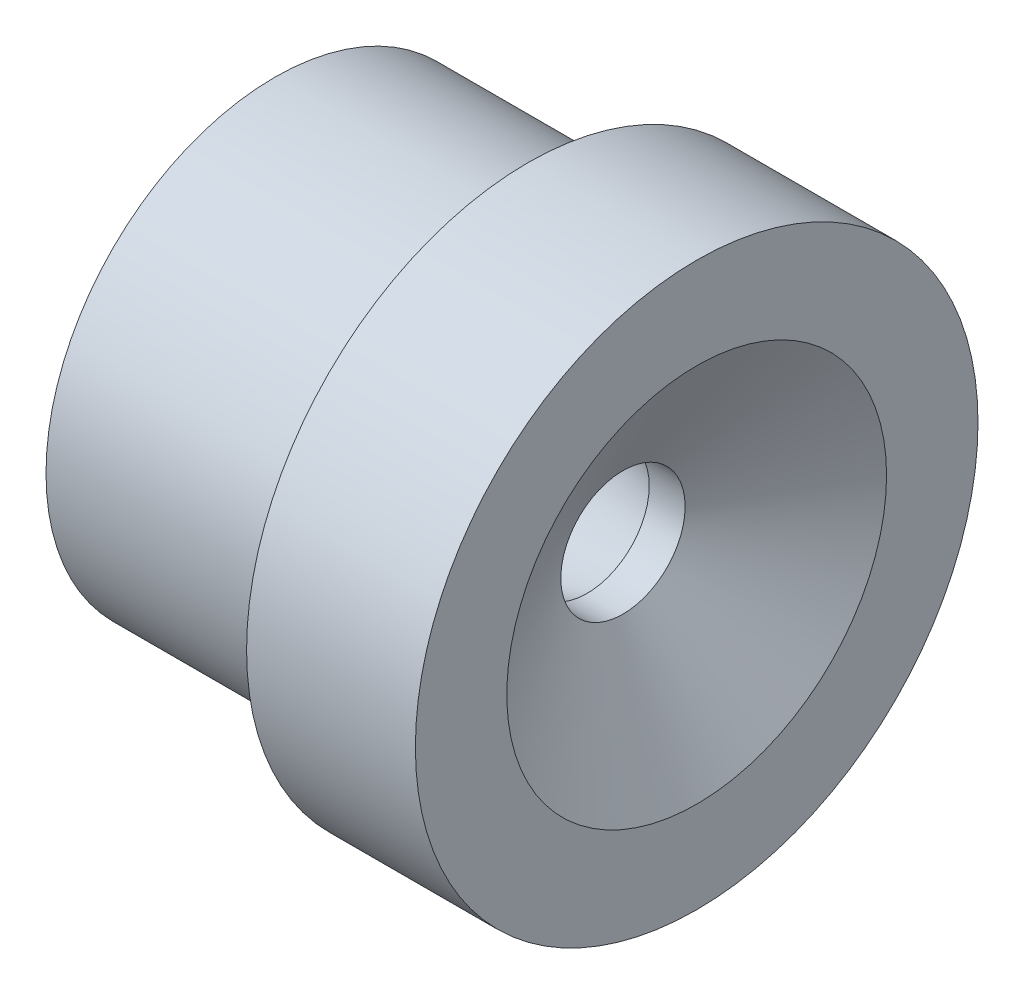
ISO-10303-21;
HEADER;
FILE_DESCRIPTION(('STEP AP214'),'2;1');
FILE_NAME('part.step','',(''),(''),'','','');
FILE_SCHEMA(('AUTOMOTIVE_DESIGN { 1 0 10303 214 1 1 1 1 }'));
ENDSEC;
DATA;
#1=APPLICATION_CONTEXT('core data for automotive mechanical design processes');
#2=APPLICATION_PROTOCOL_DEFINITION('international standard','automotive_design',2000,#1);
#3=PRODUCT_CONTEXT('',#1,'mechanical');
#4=PRODUCT('Part','Part','',(#3));
#5=PRODUCT_RELATED_PRODUCT_CATEGORY('part','',(#4));
#6=PRODUCT_DEFINITION_FORMATION('','',#4);
#7=PRODUCT_DEFINITION_CONTEXT('part definition',#1,'design');
#8=PRODUCT_DEFINITION('design','',#6,#7);
#9=PRODUCT_DEFINITION_SHAPE('','',#8);
#10=(LENGTH_UNIT() NAMED_UNIT(*) SI_UNIT(.MILLI.,.METRE.));
#11=(NAMED_UNIT(*) PLANE_ANGLE_UNIT() SI_UNIT($,.RADIAN.));
#12=(NAMED_UNIT(*) SI_UNIT($,.STERADIAN.) SOLID_ANGLE_UNIT());
#13=UNCERTAINTY_MEASURE_WITH_UNIT(LENGTH_MEASURE(1.E-05),#10,'distance_accuracy_value','');
#14=(GEOMETRIC_REPRESENTATION_CONTEXT(3) GLOBAL_UNCERTAINTY_ASSIGNED_CONTEXT((#13)) GLOBAL_UNIT_ASSIGNED_CONTEXT((#10,
#11,#12)) REPRESENTATION_CONTEXT('',''));
#15=CARTESIAN_POINT('',(0.,0.,0.));
#16=DIRECTION('',(0.,0.,1.));
#17=DIRECTION('',(1.,0.,0.));
#18=AXIS2_PLACEMENT_3D('',#15,#16,#17);
#19=CARTESIAN_POINT('',(5.11872970120267,0.,-12.7));
#20=DIRECTION('',(1.,0.,0.));
#21=DIRECTION('',(0.,0.,-1.));
#22=AXIS2_PLACEMENT_3D('',#19,#20,#21);
#23=CYLINDRICAL_SURFACE('',#22,12.7);
#24=CARTESIAN_POINT('',(0.,0.,-12.7));
#25=DIRECTION('',(1.,0.,0.));
#26=DIRECTION('',(0.,0.,-1.));
#27=AXIS2_PLACEMENT_3D('',#24,#25,#26);
#28=CIRCLE('',#27,12.7);
#29=CARTESIAN_POINT('',(0.,0.,-25.4));
#30=VERTEX_POINT('',#29);
#31=EDGE_CURVE('E13',#30,#30,#28,.T.);
#32=ORIENTED_EDGE('',*,*,#31,.F.);
#33=EDGE_LOOP('',(#32));
#34=FACE_BOUND('',#33,.T.);
#35=CARTESIAN_POINT('',(-7.62,0.,-12.7));
#36=DIRECTION('',(1.,0.,0.));
#37=DIRECTION('',(0.,0.,-1.));
#38=AXIS2_PLACEMENT_3D('',#35,#36,#37);
#39=CIRCLE('',#38,12.7);
#40=CARTESIAN_POINT('',(-7.62000000000001,0.,-25.4));
#41=VERTEX_POINT('',#40);
#42=EDGE_CURVE('E96',#41,#41,#39,.T.);
#43=ORIENTED_EDGE('',*,*,#42,.T.);
#44=EDGE_LOOP('',(#43));
#45=FACE_BOUND('',#44,.T.);
#46=ADVANCED_FACE('F56',(#34,#45),#23,.T.);
#47=CARTESIAN_POINT('',(0.,0.,0.));
#48=DIRECTION('',(-1.,0.,0.));
#49=DIRECTION('',(0.,0.,1.));
#50=AXIS2_PLACEMENT_3D('',#47,#48,#49);
#51=PLANE('',#50);
#52=CARTESIAN_POINT('',(0.,0.,-12.7));
#53=DIRECTION('',(1.,0.,0.));
#54=DIRECTION('',(0.,0.,-1.));
#55=AXIS2_PLACEMENT_3D('',#52,#53,#54);
#56=CIRCLE('',#55,8.5725);
#57=CARTESIAN_POINT('',(0.,0.,-21.2725));
#58=VERTEX_POINT('',#57);
#59=EDGE_CURVE('E68',#58,#58,#56,.T.);
#60=ORIENTED_EDGE('',*,*,#59,.F.);
#61=EDGE_LOOP('',(#60));
#62=FACE_BOUND('',#61,.T.);
#63=ORIENTED_EDGE('',*,*,#31,.T.);
#64=EDGE_LOOP('',(#63));
#65=FACE_BOUND('',#64,.T.);
#66=ADVANCED_FACE('F132',(#62,#65),#51,.F.);
#67=CARTESIAN_POINT('',(0.,0.,-12.7));
#68=DIRECTION('',(1.,0.,0.));
#69=DIRECTION('',(0.,0.,-1.));
#70=AXIS2_PLACEMENT_3D('',#67,#68,#69);
#71=CONICAL_SURFACE('',#70,8.5725,1.0471975511966);
#72=CARTESIAN_POINT('',(-3.32888618209353,0.,-12.7));
#73=DIRECTION('',(1.,0.,0.));
#74=DIRECTION('',(0.,0.,-1.));
#75=AXIS2_PLACEMENT_3D('',#72,#73,#74);
#76=CIRCLE('',#75,2.8067);
#77=CARTESIAN_POINT('',(-3.32888618209353,0.,-15.5067));
#78=VERTEX_POINT('',#77);
#79=EDGE_CURVE('E75',#78,#78,#76,.T.);
#80=CARTESIAN_POINT('',(-3.32888618209353,0.,-15.5067));
#81=CARTESIAN_POINT('',(-3.29421028436339,0.,-15.5667604166667));
#82=CARTESIAN_POINT('',(-3.25953438663325,0.,-15.6268208333333));
#83=CARTESIAN_POINT('',(-3.19018259117297,0.,-15.7469416666667));
#84=CARTESIAN_POINT('',(-3.15550669344282,0.,-15.8070020833333));
#85=CARTESIAN_POINT('',(-3.08615489798254,0.,-15.9271229166667));
#86=CARTESIAN_POINT('',(-3.0514790002524,0.,-15.9871833333333));
#87=CARTESIAN_POINT('',(-2.98212720479212,0.,-16.1073041666667));
#88=CARTESIAN_POINT('',(-2.94745130706198,0.,-16.1673645833333));
#89=CARTESIAN_POINT('',(-2.8780995116017,0.,-16.2874854166667));
#90=CARTESIAN_POINT('',(-2.84342361387156,0.,-16.3475458333333));
#91=CARTESIAN_POINT('',(-2.77407181841128,0.,-16.4676666666667));
#92=CARTESIAN_POINT('',(-2.73939592068113,0.,-16.5277270833333));
#93=CARTESIAN_POINT('',(-2.67004412522085,0.,-16.6478479166667));
#94=CARTESIAN_POINT('',(-2.63536822749071,0.,-16.7079083333333));
#95=CARTESIAN_POINT('',(-2.56601643203043,0.,-16.8280291666667));
#96=CARTESIAN_POINT('',(-2.53134053430029,0.,-16.8880895833333));
#97=CARTESIAN_POINT('',(-2.46198873884001,0.,-17.0082104166667));
#98=CARTESIAN_POINT('',(-2.42731284110987,0.,-17.0682708333333));
#99=CARTESIAN_POINT('',(-2.35796104564958,0.,-17.1883916666667));
#100=CARTESIAN_POINT('',(-2.32328514791944,0.,-17.2484520833333));
#101=CARTESIAN_POINT('',(-2.25393335245916,0.,-17.3685729166667));
#102=CARTESIAN_POINT('',(-2.21925745472902,0.,-17.4286333333333));
#103=CARTESIAN_POINT('',(-2.14990565926874,0.,-17.5487541666667));
#104=CARTESIAN_POINT('',(-2.1152297615386,0.,-17.6088145833333));
#105=CARTESIAN_POINT('',(-2.04587796607832,0.,-17.7289354166667));
#106=CARTESIAN_POINT('',(-2.01120206834818,0.,-17.7889958333333));
#107=CARTESIAN_POINT('',(-1.94185027288789,0.,-17.9091166666667));
#108=CARTESIAN_POINT('',(-1.90717437515775,0.,-17.9691770833333));
#109=CARTESIAN_POINT('',(-1.83782257969747,0.,-18.0892979166667));
#110=CARTESIAN_POINT('',(-1.80314668196733,0.,-18.1493583333333));
#111=CARTESIAN_POINT('',(-1.73379488650705,0.,-18.2694791666667));
#112=CARTESIAN_POINT('',(-1.69911898877691,0.,-18.3295395833333));
#113=CARTESIAN_POINT('',(-1.62976719331663,0.,-18.4496604166667));
#114=CARTESIAN_POINT('',(-1.59509129558649,0.,-18.5097208333333));
#115=CARTESIAN_POINT('',(-1.5257395001262,0.,-18.6298416666667));
#116=CARTESIAN_POINT('',(-1.49106360239606,0.,-18.6899020833333));
#117=CARTESIAN_POINT('',(-1.42171180693578,0.,-18.8100229166667));
#118=CARTESIAN_POINT('',(-1.38703590920564,0.,-18.8700833333333));
#119=CARTESIAN_POINT('',(-1.31768411374536,0.,-18.9902041666667));
#120=CARTESIAN_POINT('',(-1.28300821601522,0.,-19.0502645833333));
#121=CARTESIAN_POINT('',(-1.21365642055494,0.,-19.1703854166667));
#122=CARTESIAN_POINT('',(-1.17898052282479,0.,-19.2304458333333));
#123=CARTESIAN_POINT('',(-1.10962872736451,0.,-19.3505666666667));
#124=CARTESIAN_POINT('',(-1.07495282963437,0.,-19.4106270833333));
#125=CARTESIAN_POINT('',(-1.00560103417409,0.,-19.5307479166667));
#126=CARTESIAN_POINT('',(-0.97092513644395,0.,-19.5908083333333));
#127=CARTESIAN_POINT('',(-0.901573340983668,0.,-19.7109291666667));
#128=CARTESIAN_POINT('',(-0.866897443253527,0.,-19.7709895833333));
#129=CARTESIAN_POINT('',(-0.797545647793245,0.,-19.8911104166667));
#130=CARTESIAN_POINT('',(-0.762869750063105,0.,-19.9511708333333));
#131=CARTESIAN_POINT('',(-0.693517954602823,0.,-20.0712916666667));
#132=CARTESIAN_POINT('',(-0.658842056872682,0.,-20.1313520833333));
#133=CARTESIAN_POINT('',(-0.5894902614124,0.,-20.2514729166667));
#134=CARTESIAN_POINT('',(-0.554814363682259,0.,-20.3115333333333));
#135=CARTESIAN_POINT('',(-0.485462568221978,0.,-20.4316541666667));
#136=CARTESIAN_POINT('',(-0.450786670491837,0.,-20.4917145833333));
#137=CARTESIAN_POINT('',(-0.381434875031555,0.,-20.6118354166667));
#138=CARTESIAN_POINT('',(-0.346758977301414,0.,-20.6718958333333));
#139=CARTESIAN_POINT('',(-0.277407181841132,0.,-20.7920166666667));
#140=CARTESIAN_POINT('',(-0.242731284110991,0.,-20.8520770833333));
#141=CARTESIAN_POINT('',(-0.17337948865071,0.,-20.9721979166667));
#142=CARTESIAN_POINT('',(-0.138703590920569,0.,-21.0322583333333));
#143=CARTESIAN_POINT('',(-0.0693517954602867,0.,-21.1523791666667));
#144=CARTESIAN_POINT('',(-0.0346758977301458,0.,-21.2124395833333));
#145=CARTESIAN_POINT('',(0.,0.,-21.2725));
#146=B_SPLINE_CURVE_WITH_KNOTS('',3,(#80,#81,#82,#83,#84,#85,#86,#87,#88,#89,#90,#91,#92,#93,
#94,#95,#96,#97,#98,#99,#100,#101,#102,#103,#104,#105,#106,#107,#108,#109,#110,#111,#112,#113,
#114,#115,#116,#117,#118,#119,#120,#121,#122,#123,#124,#125,#126,#127,#128,#129,#130,#131,#132,
#133,#134,#135,#136,#137,#138,#139,#140,#141,#142,#143,#144,#145),.UNSPECIFIED.,.F.,.F.,(4,2,2,
2,2,2,2,2,2,2,2,2,2,2,2,2,2,2,2,2,2,2,2,2,2,2,2,2,2,2,2,2,4),(0.,0.208055386380846,
0.416110772761693,0.62416615914254,0.832221545523385,1.04027693190423,1.24833231828508,
1.45638770466592,1.66444309104677,1.87249847742762,2.08055386380846,2.28860925018931,
2.49666463657015,2.704720022951,2.91277540933185,3.12083079571269,3.32888618209354,
3.53694156847439,3.74499695485523,3.95305234123608,4.16110772761692,4.36916311399777,
4.57721850037862,4.78527388675946,4.99332927314031,5.20138465952115,5.409440045902,
5.61749543228284,5.82555081866369,6.03360620504454,6.24166159142538,6.44971697780623,
6.65777236418708),.UNSPECIFIED.);
#147=EDGE_CURVE('BSEAM128',#78,#58,#146,.T.);
#148=ORIENTED_EDGE('',*,*,#79,.F.);
#149=ORIENTED_EDGE('',*,*,#59,.T.);
#150=ORIENTED_EDGE('',*,*,#147,.T.);
#151=ORIENTED_EDGE('',*,*,#147,.F.);
#152=EDGE_LOOP('',(#148,#150,#149,#151));
#153=FACE_BOUND('',#152,.T.);
#154=ADVANCED_FACE('F128',(#153),#71,.F.);
#155=CARTESIAN_POINT('',(5.11872970120267,0.,-12.7));
#156=DIRECTION('',(1.,0.,0.));
#157=DIRECTION('',(0.,0.,-1.));
#158=AXIS2_PLACEMENT_3D('',#155,#156,#157);
#159=CYLINDRICAL_SURFACE('',#158,2.8067);
#160=CARTESIAN_POINT('',(-4.94940618209353,0.,-12.7));
#161=DIRECTION('',(1.,0.,0.));
#162=DIRECTION('',(0.,0.,-1.));
#163=AXIS2_PLACEMENT_3D('',#160,#161,#162);
#164=CIRCLE('',#163,2.8067);
#165=CARTESIAN_POINT('',(-4.94940618209353,0.,-15.5067));
#166=VERTEX_POINT('',#165);
#167=EDGE_CURVE('E80',#166,#166,#164,.T.);
#168=ORIENTED_EDGE('',*,*,#167,.F.);
#169=EDGE_LOOP('',(#168));
#170=FACE_BOUND('',#169,.T.);
#171=ORIENTED_EDGE('',*,*,#79,.T.);
#172=EDGE_LOOP('',(#171));
#173=FACE_BOUND('',#172,.T.);
#174=ADVANCED_FACE('F124',(#170,#173),#159,.F.);
#175=CARTESIAN_POINT('',(-4.94940618209353,0.,-12.7));
#176=DIRECTION('',(-1.,0.,0.));
#177=DIRECTION('',(0.,0.,1.));
#178=AXIS2_PLACEMENT_3D('',#175,#176,#177);
#179=CONICAL_SURFACE('',#178,2.8067,0.26179938779915);
#180=CARTESIAN_POINT('',(-19.05,0.,-12.7));
#181=DIRECTION('',(1.,0.,0.));
#182=DIRECTION('',(0.,0.,-1.));
#183=AXIS2_PLACEMENT_3D('',#180,#181,#182);
#184=CIRCLE('',#183,6.58494272630733);
#185=CARTESIAN_POINT('',(-19.05,0.,-19.2849427263073));
#186=VERTEX_POINT('',#185);
#187=EDGE_CURVE('E83',#186,#186,#184,.T.);
#188=ORIENTED_EDGE('',*,*,#187,.F.);
#189=EDGE_LOOP('',(#188));
#190=FACE_BOUND('',#189,.T.);
#191=ORIENTED_EDGE('',*,*,#167,.T.);
#192=EDGE_LOOP('',(#191));
#193=FACE_BOUND('',#192,.T.);
#194=ADVANCED_FACE('F120',(#190,#193),#179,.F.);
#195=CARTESIAN_POINT('',(-19.05,0.,-6.11505727369267));
#196=DIRECTION('',(1.,0.,0.));
#197=DIRECTION('',(0.,0.,-1.));
#198=AXIS2_PLACEMENT_3D('',#195,#196,#197);
#199=PLANE('',#198);
#200=CARTESIAN_POINT('',(-19.05,0.,-12.7));
#201=DIRECTION('',(1.,0.,0.));
#202=DIRECTION('',(0.,0.,-1.));
#203=AXIS2_PLACEMENT_3D('',#200,#201,#202);
#204=CIRCLE('',#203,10.3251);
#205=CARTESIAN_POINT('',(-19.05,0.,-23.0251));
#206=VERTEX_POINT('',#205);
#207=EDGE_CURVE('E86',#206,#206,#204,.T.);
#208=ORIENTED_EDGE('',*,*,#207,.F.);
#209=EDGE_LOOP('',(#208));
#210=FACE_BOUND('',#209,.T.);
#211=ORIENTED_EDGE('',*,*,#187,.T.);
#212=EDGE_LOOP('',(#211));
#213=FACE_BOUND('',#212,.T.);
#214=ADVANCED_FACE('F115',(#210,#213),#199,.F.);
#215=CARTESIAN_POINT('',(5.11872970120267,0.,-12.7));
#216=DIRECTION('',(1.,0.,0.));
#217=DIRECTION('',(0.,0.,-1.));
#218=AXIS2_PLACEMENT_3D('',#215,#216,#217);
#219=CYLINDRICAL_SURFACE('',#218,10.3251);
#220=CARTESIAN_POINT('',(-7.62,0.,-12.7));
#221=DIRECTION('',(1.,0.,0.));
#222=DIRECTION('',(0.,0.,-1.));
#223=AXIS2_PLACEMENT_3D('',#220,#221,#222);
#224=CIRCLE('',#223,10.3251);
#225=CARTESIAN_POINT('',(-7.62,0.,-23.0251));
#226=VERTEX_POINT('',#225);
#227=EDGE_CURVE('E95',#226,#226,#224,.T.);
#228=ORIENTED_EDGE('',*,*,#227,.F.);
#229=EDGE_LOOP('',(#228));
#230=FACE_BOUND('',#229,.T.);
#231=ORIENTED_EDGE('',*,*,#207,.T.);
#232=EDGE_LOOP('',(#231));
#233=FACE_BOUND('',#232,.T.);
#234=ADVANCED_FACE('F106',(#230,#233),#219,.T.);
#235=CARTESIAN_POINT('',(-7.62,0.,-2.3749));
#236=DIRECTION('',(1.,0.,0.));
#237=DIRECTION('',(0.,0.,-1.));
#238=AXIS2_PLACEMENT_3D('',#235,#236,#237);
#239=PLANE('',#238);
#240=ORIENTED_EDGE('',*,*,#42,.F.);
#241=EDGE_LOOP('',(#240));
#242=FACE_BOUND('',#241,.T.);
#243=ORIENTED_EDGE('',*,*,#227,.T.);
#244=EDGE_LOOP('',(#243));
#245=FACE_BOUND('',#244,.T.);
#246=ADVANCED_FACE('F103',(#242,#245),#239,.F.);
#247=CLOSED_SHELL('',(#46,#66,#154,#174,#194,#214,#234,#246));
#248=MANIFOLD_SOLID_BREP('B2',#247);
#249=ADVANCED_BREP_SHAPE_REPRESENTATION('',(#18,#248),#14);
#250=SHAPE_DEFINITION_REPRESENTATION(#9,#249);
ENDSEC;
END-ISO-10303-21;
